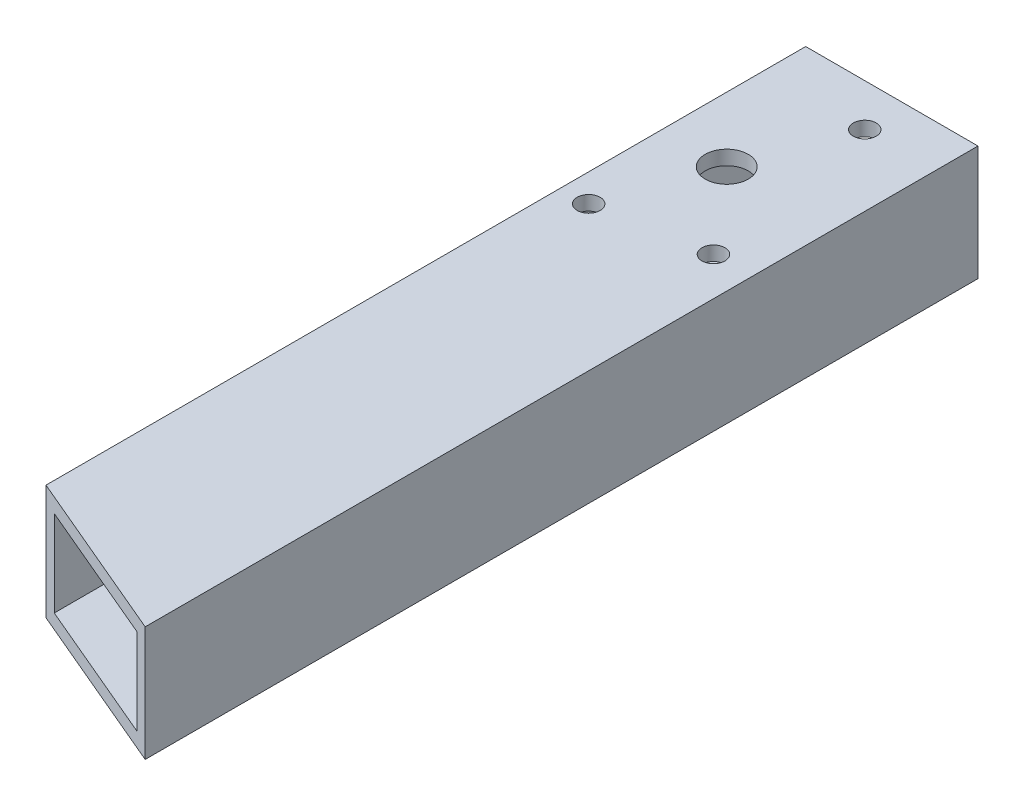
ISO-10303-21;
HEADER;
FILE_DESCRIPTION(('STEP AP214'),'2;1');
FILE_NAME('part.step','',(''),(''),'','','');
FILE_SCHEMA(('AUTOMOTIVE_DESIGN { 1 0 10303 214 1 1 1 1 }'));
ENDSEC;
DATA;
#1=APPLICATION_CONTEXT('core data for automotive mechanical design processes');
#2=APPLICATION_PROTOCOL_DEFINITION('international standard','automotive_design',2000,#1);
#3=PRODUCT_CONTEXT('',#1,'mechanical');
#4=PRODUCT('Part','Part','',(#3));
#5=PRODUCT_RELATED_PRODUCT_CATEGORY('part','',(#4));
#6=PRODUCT_DEFINITION_FORMATION('','',#4);
#7=PRODUCT_DEFINITION_CONTEXT('part definition',#1,'design');
#8=PRODUCT_DEFINITION('design','',#6,#7);
#9=PRODUCT_DEFINITION_SHAPE('','',#8);
#10=(LENGTH_UNIT() NAMED_UNIT(*) SI_UNIT(.MILLI.,.METRE.));
#11=(NAMED_UNIT(*) PLANE_ANGLE_UNIT() SI_UNIT($,.RADIAN.));
#12=(NAMED_UNIT(*) SI_UNIT($,.STERADIAN.) SOLID_ANGLE_UNIT());
#13=UNCERTAINTY_MEASURE_WITH_UNIT(LENGTH_MEASURE(1.E-05),#10,'distance_accuracy_value','');
#14=(GEOMETRIC_REPRESENTATION_CONTEXT(3) GLOBAL_UNCERTAINTY_ASSIGNED_CONTEXT((#13)) GLOBAL_UNIT_ASSIGNED_CONTEXT((#10,
#11,#12)) REPRESENTATION_CONTEXT('',''));
#15=CARTESIAN_POINT('',(0.,0.,0.));
#16=DIRECTION('',(0.,0.,1.));
#17=DIRECTION('',(1.,0.,0.));
#18=AXIS2_PLACEMENT_3D('',#15,#16,#17);
#19=CARTESIAN_POINT('',(0.,0.,0.));
#20=DIRECTION('',(0.,0.,1.));
#21=DIRECTION('',(1.,0.,0.));
#22=AXIS2_PLACEMENT_3D('',#19,#20,#21);
#23=PLANE('',#22);
#24=DIRECTION('',(0.,1.,0.));
#25=VECTOR('',#24,1.);
#26=CARTESIAN_POINT('',(19.05,12.7,0.));
#27=LINE('',#26,#25);
#28=CARTESIAN_POINT('',(19.05,-12.7,0.));
#29=VERTEX_POINT('',#28);
#30=CARTESIAN_POINT('',(19.05,12.7,0.));
#31=VERTEX_POINT('',#30);
#32=EDGE_CURVE('E118',#29,#31,#27,.T.);
#33=ORIENTED_EDGE('',*,*,#32,.F.);
#34=DIRECTION('',(1.,0.,0.));
#35=VECTOR('',#34,1.);
#36=CARTESIAN_POINT('',(-19.05,-12.7,0.));
#37=LINE('',#36,#35);
#38=CARTESIAN_POINT('',(-19.05,-12.7,0.));
#39=VERTEX_POINT('',#38);
#40=EDGE_CURVE('E106',#39,#29,#37,.T.);
#41=ORIENTED_EDGE('',*,*,#40,.F.);
#42=DIRECTION('',(0.,-1.,0.));
#43=VECTOR('',#42,1.);
#44=CARTESIAN_POINT('',(-19.05,12.7,0.));
#45=LINE('',#44,#43);
#46=CARTESIAN_POINT('',(-19.05,12.7,0.));
#47=VERTEX_POINT('',#46);
#48=EDGE_CURVE('E194',#47,#39,#45,.T.);
#49=ORIENTED_EDGE('',*,*,#48,.F.);
#50=DIRECTION('',(-1.,0.,0.));
#51=VECTOR('',#50,1.);
#52=CARTESIAN_POINT('',(-19.05,12.7,0.));
#53=LINE('',#52,#51);
#54=EDGE_CURVE('E192',#31,#47,#53,.T.);
#55=ORIENTED_EDGE('',*,*,#54,.F.);
#56=EDGE_LOOP('',(#33,#41,#49,#55));
#57=FACE_BOUND('',#56,.T.);
#58=DIRECTION('',(0.,1.,0.));
#59=VECTOR('',#58,1.);
#60=CARTESIAN_POINT('',(15.875,9.525,0.));
#61=LINE('',#60,#59);
#62=CARTESIAN_POINT('',(15.875,-9.525,0.));
#63=VERTEX_POINT('',#62);
#64=CARTESIAN_POINT('',(15.875,9.525,0.));
#65=VERTEX_POINT('',#64);
#66=EDGE_CURVE('E171',#63,#65,#61,.T.);
#67=ORIENTED_EDGE('',*,*,#66,.T.);
#68=DIRECTION('',(-1.,0.,0.));
#69=VECTOR('',#68,1.);
#70=CARTESIAN_POINT('',(-15.875,9.525,0.));
#71=LINE('',#70,#69);
#72=CARTESIAN_POINT('',(-15.875,9.525,0.));
#73=VERTEX_POINT('',#72);
#74=EDGE_CURVE('E174',#65,#73,#71,.T.);
#75=ORIENTED_EDGE('',*,*,#74,.T.);
#76=DIRECTION('',(0.,-1.,0.));
#77=VECTOR('',#76,1.);
#78=CARTESIAN_POINT('',(-15.875,9.525,0.));
#79=LINE('',#78,#77);
#80=CARTESIAN_POINT('',(-15.875,-9.525,0.));
#81=VERTEX_POINT('',#80);
#82=EDGE_CURVE('E177',#73,#81,#79,.T.);
#83=ORIENTED_EDGE('',*,*,#82,.T.);
#84=DIRECTION('',(1.,0.,0.));
#85=VECTOR('',#84,1.);
#86=CARTESIAN_POINT('',(-15.875,-9.525,0.));
#87=LINE('',#86,#85);
#88=EDGE_CURVE('E180',#81,#63,#87,.T.);
#89=ORIENTED_EDGE('',*,*,#88,.T.);
#90=EDGE_LOOP('',(#67,#75,#83,#89));
#91=FACE_BOUND('',#90,.T.);
#92=ADVANCED_FACE('F32',(#57,#91),#23,.F.);
#93=CARTESIAN_POINT('',(19.05,12.7,184.15));
#94=DIRECTION('',(-1.,0.,0.));
#95=DIRECTION('',(0.,-1.,0.));
#96=AXIS2_PLACEMENT_3D('',#93,#94,#95);
#97=PLANE('',#96);
#98=ORIENTED_EDGE('',*,*,#32,.T.);
#99=DIRECTION('',(0.,0.,-1.));
#100=VECTOR('',#99,1.);
#101=CARTESIAN_POINT('',(19.05,12.7,184.15));
#102=LINE('',#101,#100);
#103=CARTESIAN_POINT('',(19.05,12.7,184.15));
#104=VERTEX_POINT('',#103);
#105=EDGE_CURVE('E41',#104,#31,#102,.T.);
#106=ORIENTED_EDGE('',*,*,#105,.F.);
#107=DIRECTION('',(0.,1.,0.));
#108=VECTOR('',#107,1.);
#109=CARTESIAN_POINT('',(19.05,12.7,184.15));
#110=LINE('',#109,#108);
#111=CARTESIAN_POINT('',(19.05,-12.7,184.15));
#112=VERTEX_POINT('',#111);
#113=EDGE_CURVE('E96',#112,#104,#110,.T.);
#114=ORIENTED_EDGE('',*,*,#113,.F.);
#115=DIRECTION('',(0.,0.,-1.));
#116=VECTOR('',#115,1.);
#117=CARTESIAN_POINT('',(19.05,-12.7,184.15));
#118=LINE('',#117,#116);
#119=EDGE_CURVE('E105',#112,#29,#118,.T.);
#120=ORIENTED_EDGE('',*,*,#119,.T.);
#121=EDGE_LOOP('',(#98,#106,#114,#120));
#122=FACE_BOUND('',#121,.T.);
#123=ADVANCED_FACE('F34',(#122),#97,.F.);
#124=CARTESIAN_POINT('',(-19.05,12.7,184.15));
#125=DIRECTION('',(0.,-1.,0.));
#126=DIRECTION('',(0.,0.,-1.));
#127=AXIS2_PLACEMENT_3D('',#124,#125,#126);
#128=PLANE('',#127);
#129=CARTESIAN_POINT('',(10.5438799556607,12.7,49.9914333017707));
#130=DIRECTION('',(0.,1.,0.));
#131=DIRECTION('',(0.,0.,1.));
#132=AXIS2_PLACEMENT_3D('',#129,#130,#131);
#133=CIRCLE('',#132,2.54);
#134=CARTESIAN_POINT('',(10.5438799556607,12.7,52.5314333017707));
#135=VERTEX_POINT('',#134);
#136=EDGE_CURVE('E260',#135,#135,#133,.T.);
#137=ORIENTED_EDGE('',*,*,#136,.F.);
#138=EDGE_LOOP('',(#137));
#139=FACE_BOUND('',#138,.T.);
#140=CARTESIAN_POINT('',(3.3818546629425,12.7,9.37356946753555));
#141=DIRECTION('',(0.,1.,0.));
#142=DIRECTION('',(0.,0.,1.));
#143=AXIS2_PLACEMENT_3D('',#140,#141,#142);
#144=CIRCLE('',#143,2.54);
#145=CARTESIAN_POINT('',(3.3818546629425,12.7,11.9135694675356));
#146=VERTEX_POINT('',#145);
#147=EDGE_CURVE('E142',#146,#146,#144,.T.);
#148=ORIENTED_EDGE('',*,*,#147,.F.);
#149=EDGE_LOOP('',(#148));
#150=FACE_BOUND('',#149,.T.);
#151=CARTESIAN_POINT('',(-12.9068546629425,12.7,54.1264305324644));
#152=DIRECTION('',(0.,1.,0.));
#153=DIRECTION('',(0.,0.,1.));
#154=AXIS2_PLACEMENT_3D('',#151,#152,#153);
#155=CIRCLE('',#154,2.54);
#156=CARTESIAN_POINT('',(-12.9068546629425,12.7,56.6664305324644));
#157=VERTEX_POINT('',#156);
#158=EDGE_CURVE('E139',#157,#157,#155,.T.);
#159=ORIENTED_EDGE('',*,*,#158,.F.);
#160=EDGE_LOOP('',(#159));
#161=FACE_BOUND('',#160,.T.);
#162=CARTESIAN_POINT('',(-4.7625,12.7,31.75));
#163=DIRECTION('',(0.,1.,0.));
#164=DIRECTION('',(0.,0.,1.));
#165=AXIS2_PLACEMENT_3D('',#162,#163,#164);
#166=CIRCLE('',#165,4.7625);
#167=CARTESIAN_POINT('',(-4.7625,12.7,36.5125));
#168=VERTEX_POINT('',#167);
#169=EDGE_CURVE('E157',#168,#168,#166,.T.);
#170=ORIENTED_EDGE('',*,*,#169,.F.);
#171=EDGE_LOOP('',(#170));
#172=FACE_BOUND('',#171,.T.);
#173=DIRECTION('',(0.,0.,-1.));
#174=VECTOR('',#173,1.);
#175=CARTESIAN_POINT('',(-19.05,12.7,184.15));
#176=LINE('',#175,#174);
#177=CARTESIAN_POINT('',(-19.05,12.7,167.977509502414));
#178=VERTEX_POINT('',#177);
#179=EDGE_CURVE('E114',#178,#47,#176,.T.);
#180=ORIENTED_EDGE('',*,*,#179,.F.);
#181=DIRECTION('',(-0.920504853452443,0.,-0.390731128489268));
#182=VECTOR('',#181,1.);
#183=CARTESIAN_POINT('',(19.05,12.7,184.15));
#184=LINE('',#183,#182);
#185=EDGE_CURVE('E99',#104,#178,#184,.T.);
#186=ORIENTED_EDGE('',*,*,#185,.F.);
#187=ORIENTED_EDGE('',*,*,#105,.T.);
#188=ORIENTED_EDGE('',*,*,#54,.T.);
#189=EDGE_LOOP('',(#180,#186,#187,#188));
#190=FACE_BOUND('',#189,.T.);
#191=ADVANCED_FACE('F111',(#139,#150,#161,#172,#190),#128,.F.);
#192=CARTESIAN_POINT('',(-19.05,12.7,184.15));
#193=DIRECTION('',(1.,0.,0.));
#194=DIRECTION('',(0.,1.,0.));
#195=AXIS2_PLACEMENT_3D('',#192,#193,#194);
#196=PLANE('',#195);
#197=DIRECTION('',(0.,0.,-1.));
#198=VECTOR('',#197,1.);
#199=CARTESIAN_POINT('',(-19.05,-12.7,184.15));
#200=LINE('',#199,#198);
#201=CARTESIAN_POINT('',(-19.05,-12.7,167.977509502414));
#202=VERTEX_POINT('',#201);
#203=EDGE_CURVE('E120',#202,#39,#200,.T.);
#204=ORIENTED_EDGE('',*,*,#203,.F.);
#205=DIRECTION('',(0.,1.,0.));
#206=VECTOR('',#205,1.);
#207=CARTESIAN_POINT('',(-19.05,-54.0903303791417,167.977509502414));
#208=LINE('',#207,#206);
#209=EDGE_CURVE('E49',#202,#178,#208,.T.);
#210=ORIENTED_EDGE('',*,*,#209,.T.);
#211=ORIENTED_EDGE('',*,*,#179,.T.);
#212=ORIENTED_EDGE('',*,*,#48,.T.);
#213=EDGE_LOOP('',(#204,#210,#211,#212));
#214=FACE_BOUND('',#213,.T.);
#215=ADVANCED_FACE('F204',(#214),#196,.F.);
#216=CARTESIAN_POINT('',(-19.05,-12.7,184.15));
#217=DIRECTION('',(0.,1.,0.));
#218=DIRECTION('',(0.,0.,1.));
#219=AXIS2_PLACEMENT_3D('',#216,#217,#218);
#220=PLANE('',#219);
#221=CARTESIAN_POINT('',(10.5438799556607,-12.7,49.9914333017707));
#222=DIRECTION('',(0.,1.,0.));
#223=DIRECTION('',(0.,0.,1.));
#224=AXIS2_PLACEMENT_3D('',#221,#222,#223);
#225=CIRCLE('',#224,2.54);
#226=CARTESIAN_POINT('',(10.5438799556607,-12.7,52.5314333017707));
#227=VERTEX_POINT('',#226);
#228=EDGE_CURVE('E302',#227,#227,#225,.F.);
#229=ORIENTED_EDGE('',*,*,#228,.F.);
#230=EDGE_LOOP('',(#229));
#231=FACE_BOUND('',#230,.T.);
#232=CARTESIAN_POINT('',(3.3818546629425,-12.7,9.37356946753555));
#233=DIRECTION('',(0.,1.,0.));
#234=DIRECTION('',(0.,0.,1.));
#235=AXIS2_PLACEMENT_3D('',#232,#233,#234);
#236=CIRCLE('',#235,2.54);
#237=CARTESIAN_POINT('',(3.3818546629425,-12.7,11.9135694675356));
#238=VERTEX_POINT('',#237);
#239=EDGE_CURVE('E135',#238,#238,#236,.F.);
#240=ORIENTED_EDGE('',*,*,#239,.F.);
#241=EDGE_LOOP('',(#240));
#242=FACE_BOUND('',#241,.T.);
#243=CARTESIAN_POINT('',(-12.9068546629425,-12.7,54.1264305324644));
#244=DIRECTION('',(0.,1.,0.));
#245=DIRECTION('',(0.,0.,1.));
#246=AXIS2_PLACEMENT_3D('',#243,#244,#245);
#247=CIRCLE('',#246,2.54);
#248=CARTESIAN_POINT('',(-12.9068546629425,-12.7,56.6664305324644));
#249=VERTEX_POINT('',#248);
#250=EDGE_CURVE('E131',#249,#249,#247,.F.);
#251=ORIENTED_EDGE('',*,*,#250,.F.);
#252=EDGE_LOOP('',(#251));
#253=FACE_BOUND('',#252,.T.);
#254=CARTESIAN_POINT('',(-4.7625,-12.7,31.75));
#255=DIRECTION('',(0.,1.,0.));
#256=DIRECTION('',(0.,0.,1.));
#257=AXIS2_PLACEMENT_3D('',#254,#255,#256);
#258=CIRCLE('',#257,4.7625);
#259=CARTESIAN_POINT('',(-4.7625,-12.7,36.5125));
#260=VERTEX_POINT('',#259);
#261=EDGE_CURVE('E127',#260,#260,#258,.F.);
#262=ORIENTED_EDGE('',*,*,#261,.F.);
#263=EDGE_LOOP('',(#262));
#264=FACE_BOUND('',#263,.T.);
#265=ORIENTED_EDGE('',*,*,#119,.F.);
#266=DIRECTION('',(0.920504853452443,0.,0.390731128489268));
#267=VECTOR('',#266,1.);
#268=CARTESIAN_POINT('',(19.05,-12.7,184.15));
#269=LINE('',#268,#267);
#270=EDGE_CURVE('E100',#202,#112,#269,.T.);
#271=ORIENTED_EDGE('',*,*,#270,.F.);
#272=ORIENTED_EDGE('',*,*,#203,.T.);
#273=ORIENTED_EDGE('',*,*,#40,.T.);
#274=EDGE_LOOP('',(#265,#271,#272,#273));
#275=FACE_BOUND('',#274,.T.);
#276=ADVANCED_FACE('F200',(#231,#242,#253,#264,#275),#220,.F.);
#277=CARTESIAN_POINT('',(15.875,9.525,184.15));
#278=DIRECTION('',(-1.,0.,0.));
#279=DIRECTION('',(0.,-1.,0.));
#280=AXIS2_PLACEMENT_3D('',#277,#278,#279);
#281=PLANE('',#280);
#282=DIRECTION('',(0.,-1.,0.));
#283=VECTOR('',#282,1.);
#284=CARTESIAN_POINT('',(15.875,9.525,182.802292458535));
#285=LINE('',#284,#283);
#286=CARTESIAN_POINT('',(15.875,9.525,182.802292458535));
#287=VERTEX_POINT('',#286);
#288=CARTESIAN_POINT('',(15.875,-9.525,182.802292458535));
#289=VERTEX_POINT('',#288);
#290=EDGE_CURVE('E56',#287,#289,#285,.T.);
#291=ORIENTED_EDGE('',*,*,#290,.F.);
#292=DIRECTION('',(0.,0.,-1.));
#293=VECTOR('',#292,1.);
#294=CARTESIAN_POINT('',(15.875,9.525,184.15));
#295=LINE('',#294,#293);
#296=EDGE_CURVE('E189',#287,#65,#295,.T.);
#297=ORIENTED_EDGE('',*,*,#296,.T.);
#298=ORIENTED_EDGE('',*,*,#66,.F.);
#299=DIRECTION('',(0.,0.,-1.));
#300=VECTOR('',#299,1.);
#301=CARTESIAN_POINT('',(15.875,-9.525,184.15));
#302=LINE('',#301,#300);
#303=EDGE_CURVE('E183',#289,#63,#302,.T.);
#304=ORIENTED_EDGE('',*,*,#303,.F.);
#305=EDGE_LOOP('',(#291,#297,#298,#304));
#306=FACE_BOUND('',#305,.T.);
#307=ADVANCED_FACE('F214',(#306),#281,.T.);
#308=CARTESIAN_POINT('',(-15.875,9.525,184.15));
#309=DIRECTION('',(0.,-1.,0.));
#310=DIRECTION('',(0.,0.,-1.));
#311=AXIS2_PLACEMENT_3D('',#308,#309,#310);
#312=PLANE('',#311);
#313=CARTESIAN_POINT('',(10.5438799556607,9.52500000000001,49.9914333017707));
#314=DIRECTION('',(0.,-1.,0.));
#315=DIRECTION('',(0.,0.,-1.));
#316=AXIS2_PLACEMENT_3D('',#313,#314,#315);
#317=CIRCLE('',#316,2.54);
#318=CARTESIAN_POINT('',(10.5438799556607,9.52500000000001,47.4514333017707));
#319=VERTEX_POINT('',#318);
#320=EDGE_CURVE('E147',#319,#319,#317,.T.);
#321=ORIENTED_EDGE('',*,*,#320,.F.);
#322=EDGE_LOOP('',(#321));
#323=FACE_BOUND('',#322,.T.);
#324=CARTESIAN_POINT('',(3.3818546629425,9.52500000000001,9.37356946753555));
#325=DIRECTION('',(0.,-1.,0.));
#326=DIRECTION('',(0.,0.,-1.));
#327=AXIS2_PLACEMENT_3D('',#324,#325,#326);
#328=CIRCLE('',#327,2.54);
#329=CARTESIAN_POINT('',(3.3818546629425,9.52500000000001,6.83356946753555));
#330=VERTEX_POINT('',#329);
#331=EDGE_CURVE('E134',#330,#330,#328,.T.);
#332=ORIENTED_EDGE('',*,*,#331,.F.);
#333=EDGE_LOOP('',(#332));
#334=FACE_BOUND('',#333,.T.);
#335=CARTESIAN_POINT('',(-12.9068546629425,9.52500000000001,54.1264305324644));
#336=DIRECTION('',(0.,-1.,0.));
#337=DIRECTION('',(0.,0.,-1.));
#338=AXIS2_PLACEMENT_3D('',#335,#336,#337);
#339=CIRCLE('',#338,2.54);
#340=CARTESIAN_POINT('',(-12.9068546629425,9.52500000000001,51.5864305324644));
#341=VERTEX_POINT('',#340);
#342=EDGE_CURVE('E130',#341,#341,#339,.T.);
#343=ORIENTED_EDGE('',*,*,#342,.F.);
#344=EDGE_LOOP('',(#343));
#345=FACE_BOUND('',#344,.T.);
#346=CARTESIAN_POINT('',(-4.7625,9.52500000000001,31.75));
#347=DIRECTION('',(0.,-1.,0.));
#348=DIRECTION('',(0.,0.,-1.));
#349=AXIS2_PLACEMENT_3D('',#346,#347,#348);
#350=CIRCLE('',#349,4.7625);
#351=CARTESIAN_POINT('',(-4.7625,9.52500000000001,26.9875));
#352=VERTEX_POINT('',#351);
#353=EDGE_CURVE('E115',#352,#352,#350,.T.);
#354=ORIENTED_EDGE('',*,*,#353,.F.);
#355=EDGE_LOOP('',(#354));
#356=FACE_BOUND('',#355,.T.);
#357=DIRECTION('',(0.920504853452443,0.,0.390731128489268));
#358=VECTOR('',#357,1.);
#359=CARTESIAN_POINT('',(-10.5429717941404,9.525,171.588528736586));
#360=LINE('',#359,#358);
#361=CARTESIAN_POINT('',(-15.875,9.525,169.32521704388));
#362=VERTEX_POINT('',#361);
#363=EDGE_CURVE('E168',#362,#287,#360,.T.);
#364=ORIENTED_EDGE('',*,*,#363,.F.);
#365=DIRECTION('',(0.,0.,-1.));
#366=VECTOR('',#365,1.);
#367=CARTESIAN_POINT('',(-15.875,9.525,184.15));
#368=LINE('',#367,#366);
#369=EDGE_CURVE('E187',#362,#73,#368,.T.);
#370=ORIENTED_EDGE('',*,*,#369,.T.);
#371=ORIENTED_EDGE('',*,*,#74,.F.);
#372=ORIENTED_EDGE('',*,*,#296,.F.);
#373=EDGE_LOOP('',(#364,#370,#371,#372));
#374=FACE_BOUND('',#373,.T.);
#375=ADVANCED_FACE('F218',(#323,#334,#345,#356,#374),#312,.T.);
#376=CARTESIAN_POINT('',(-15.875,9.525,184.15));
#377=DIRECTION('',(1.,0.,0.));
#378=DIRECTION('',(0.,1.,0.));
#379=AXIS2_PLACEMENT_3D('',#376,#377,#378);
#380=PLANE('',#379);
#381=DIRECTION('',(0.,1.,0.));
#382=VECTOR('',#381,1.);
#383=CARTESIAN_POINT('',(-15.875,9.525,169.32521704388));
#384=LINE('',#383,#382);
#385=CARTESIAN_POINT('',(-15.875,-9.525,169.32521704388));
#386=VERTEX_POINT('',#385);
#387=EDGE_CURVE('E166',#386,#362,#384,.T.);
#388=ORIENTED_EDGE('',*,*,#387,.F.);
#389=DIRECTION('',(0.,0.,-1.));
#390=VECTOR('',#389,1.);
#391=CARTESIAN_POINT('',(-15.875,-9.525,184.15));
#392=LINE('',#391,#390);
#393=EDGE_CURVE('E185',#386,#81,#392,.T.);
#394=ORIENTED_EDGE('',*,*,#393,.T.);
#395=ORIENTED_EDGE('',*,*,#82,.F.);
#396=ORIENTED_EDGE('',*,*,#369,.F.);
#397=EDGE_LOOP('',(#388,#394,#395,#396));
#398=FACE_BOUND('',#397,.T.);
#399=ADVANCED_FACE('F223',(#398),#380,.T.);
#400=CARTESIAN_POINT('',(-15.875,-9.525,184.15));
#401=DIRECTION('',(0.,1.,0.));
#402=DIRECTION('',(0.,0.,1.));
#403=AXIS2_PLACEMENT_3D('',#400,#401,#402);
#404=PLANE('',#403);
#405=CARTESIAN_POINT('',(10.5438799556607,-9.525,49.9914333017707));
#406=DIRECTION('',(0.,1.,0.));
#407=DIRECTION('',(0.,0.,1.));
#408=AXIS2_PLACEMENT_3D('',#405,#406,#407);
#409=CIRCLE('',#408,2.54);
#410=CARTESIAN_POINT('',(10.5438799556607,-9.525,52.5314333017707));
#411=VERTEX_POINT('',#410);
#412=EDGE_CURVE('E36',#411,#411,#409,.T.);
#413=ORIENTED_EDGE('',*,*,#412,.F.);
#414=EDGE_LOOP('',(#413));
#415=FACE_BOUND('',#414,.T.);
#416=CARTESIAN_POINT('',(3.3818546629425,-9.525,9.37356946753555));
#417=DIRECTION('',(0.,1.,0.));
#418=DIRECTION('',(0.,0.,1.));
#419=AXIS2_PLACEMENT_3D('',#416,#417,#418);
#420=CIRCLE('',#419,2.54);
#421=CARTESIAN_POINT('',(3.3818546629425,-9.525,11.9135694675356));
#422=VERTEX_POINT('',#421);
#423=EDGE_CURVE('E132',#422,#422,#420,.T.);
#424=ORIENTED_EDGE('',*,*,#423,.F.);
#425=EDGE_LOOP('',(#424));
#426=FACE_BOUND('',#425,.T.);
#427=CARTESIAN_POINT('',(-12.9068546629425,-9.525,54.1264305324644));
#428=DIRECTION('',(0.,1.,0.));
#429=DIRECTION('',(0.,0.,1.));
#430=AXIS2_PLACEMENT_3D('',#427,#428,#429);
#431=CIRCLE('',#430,2.54);
#432=CARTESIAN_POINT('',(-12.9068546629425,-9.525,56.6664305324644));
#433=VERTEX_POINT('',#432);
#434=EDGE_CURVE('E128',#433,#433,#431,.T.);
#435=ORIENTED_EDGE('',*,*,#434,.F.);
#436=EDGE_LOOP('',(#435));
#437=FACE_BOUND('',#436,.T.);
#438=CARTESIAN_POINT('',(-4.7625,-9.525,31.75));
#439=DIRECTION('',(0.,1.,0.));
#440=DIRECTION('',(0.,0.,1.));
#441=AXIS2_PLACEMENT_3D('',#438,#439,#440);
#442=CIRCLE('',#441,4.7625);
#443=CARTESIAN_POINT('',(-4.7625,-9.525,36.5125));
#444=VERTEX_POINT('',#443);
#445=EDGE_CURVE('E124',#444,#444,#442,.T.);
#446=ORIENTED_EDGE('',*,*,#445,.F.);
#447=EDGE_LOOP('',(#446));
#448=FACE_BOUND('',#447,.T.);
#449=DIRECTION('',(-0.920504853452443,0.,-0.390731128489268));
#450=VECTOR('',#449,1.);
#451=CARTESIAN_POINT('',(-10.5429717941404,-9.525,171.588528736586));
#452=LINE('',#451,#450);
#453=EDGE_CURVE('E11',#289,#386,#452,.T.);
#454=ORIENTED_EDGE('',*,*,#453,.F.);
#455=ORIENTED_EDGE('',*,*,#303,.T.);
#456=ORIENTED_EDGE('',*,*,#88,.F.);
#457=ORIENTED_EDGE('',*,*,#393,.F.);
#458=EDGE_LOOP('',(#454,#455,#456,#457));
#459=FACE_BOUND('',#458,.T.);
#460=ADVANCED_FACE('F226',(#415,#426,#437,#448,#459),#404,.T.);
#461=CARTESIAN_POINT('',(19.05,-54.0903303791417,184.15));
#462=DIRECTION('',(0.390731128489268,0.,-0.920504853452443));
#463=DIRECTION('',(-0.920504853452443,0.,-0.390731128489268));
#464=AXIS2_PLACEMENT_3D('',#461,#462,#463);
#465=PLANE('',#464);
#466=ORIENTED_EDGE('',*,*,#290,.T.);
#467=ORIENTED_EDGE('',*,*,#453,.T.);
#468=ORIENTED_EDGE('',*,*,#387,.T.);
#469=ORIENTED_EDGE('',*,*,#363,.T.);
#470=EDGE_LOOP('',(#466,#467,#468,#469));
#471=FACE_BOUND('',#470,.T.);
#472=ORIENTED_EDGE('',*,*,#270,.T.);
#473=ORIENTED_EDGE('',*,*,#113,.T.);
#474=ORIENTED_EDGE('',*,*,#185,.T.);
#475=ORIENTED_EDGE('',*,*,#209,.F.);
#476=EDGE_LOOP('',(#472,#473,#474,#475));
#477=FACE_BOUND('',#476,.T.);
#478=ADVANCED_FACE('F98',(#471,#477),#465,.F.);
#479=CARTESIAN_POINT('',(-4.7625,-26.1703841816037,31.75));
#480=DIRECTION('',(0.,1.,0.));
#481=DIRECTION('',(0.,0.,1.));
#482=AXIS2_PLACEMENT_3D('',#479,#480,#481);
#483=CYLINDRICAL_SURFACE('',#482,4.7625);
#484=ORIENTED_EDGE('',*,*,#445,.T.);
#485=EDGE_LOOP('',(#484));
#486=FACE_BOUND('',#485,.T.);
#487=ORIENTED_EDGE('',*,*,#261,.T.);
#488=EDGE_LOOP('',(#487));
#489=FACE_BOUND('',#488,.T.);
#490=ADVANCED_FACE('F228',(#486,#489),#483,.F.);
#491=ORIENTED_EDGE('',*,*,#353,.T.);
#492=EDGE_LOOP('',(#491));
#493=FACE_BOUND('',#492,.T.);
#494=ORIENTED_EDGE('',*,*,#169,.T.);
#495=EDGE_LOOP('',(#494));
#496=FACE_BOUND('',#495,.T.);
#497=ADVANCED_FACE('F234',(#493,#496),#483,.F.);
#498=CARTESIAN_POINT('',(-12.9068546629425,-26.1703841816037,54.1264305324644));
#499=DIRECTION('',(0.,1.,0.));
#500=DIRECTION('',(0.,0.,1.));
#501=AXIS2_PLACEMENT_3D('',#498,#499,#500);
#502=CYLINDRICAL_SURFACE('',#501,2.54);
#503=ORIENTED_EDGE('',*,*,#434,.T.);
#504=EDGE_LOOP('',(#503));
#505=FACE_BOUND('',#504,.T.);
#506=ORIENTED_EDGE('',*,*,#250,.T.);
#507=EDGE_LOOP('',(#506));
#508=FACE_BOUND('',#507,.T.);
#509=ADVANCED_FACE('F268',(#505,#508),#502,.F.);
#510=ORIENTED_EDGE('',*,*,#342,.T.);
#511=EDGE_LOOP('',(#510));
#512=FACE_BOUND('',#511,.T.);
#513=ORIENTED_EDGE('',*,*,#158,.T.);
#514=EDGE_LOOP('',(#513));
#515=FACE_BOUND('',#514,.T.);
#516=ADVANCED_FACE('F273',(#512,#515),#502,.F.);
#517=CARTESIAN_POINT('',(3.3818546629425,-26.1703841816037,9.37356946753555));
#518=DIRECTION('',(0.,1.,0.));
#519=DIRECTION('',(0.,0.,1.));
#520=AXIS2_PLACEMENT_3D('',#517,#518,#519);
#521=CYLINDRICAL_SURFACE('',#520,2.54);
#522=ORIENTED_EDGE('',*,*,#423,.T.);
#523=EDGE_LOOP('',(#522));
#524=FACE_BOUND('',#523,.T.);
#525=ORIENTED_EDGE('',*,*,#239,.T.);
#526=EDGE_LOOP('',(#525));
#527=FACE_BOUND('',#526,.T.);
#528=ADVANCED_FACE('F280',(#524,#527),#521,.F.);
#529=ORIENTED_EDGE('',*,*,#331,.T.);
#530=EDGE_LOOP('',(#529));
#531=FACE_BOUND('',#530,.T.);
#532=ORIENTED_EDGE('',*,*,#147,.T.);
#533=EDGE_LOOP('',(#532));
#534=FACE_BOUND('',#533,.T.);
#535=ADVANCED_FACE('F286',(#531,#534),#521,.F.);
#536=CARTESIAN_POINT('',(10.5438799556607,-26.1703841816037,49.9914333017707));
#537=DIRECTION('',(0.,1.,0.));
#538=DIRECTION('',(0.,0.,1.));
#539=AXIS2_PLACEMENT_3D('',#536,#537,#538);
#540=CYLINDRICAL_SURFACE('',#539,2.54);
#541=ORIENTED_EDGE('',*,*,#412,.T.);
#542=EDGE_LOOP('',(#541));
#543=FACE_BOUND('',#542,.T.);
#544=ORIENTED_EDGE('',*,*,#228,.T.);
#545=EDGE_LOOP('',(#544));
#546=FACE_BOUND('',#545,.T.);
#547=ADVANCED_FACE('F287',(#543,#546),#540,.F.);
#548=ORIENTED_EDGE('',*,*,#320,.T.);
#549=EDGE_LOOP('',(#548));
#550=FACE_BOUND('',#549,.T.);
#551=ORIENTED_EDGE('',*,*,#136,.T.);
#552=EDGE_LOOP('',(#551));
#553=FACE_BOUND('',#552,.T.);
#554=ADVANCED_FACE('F289',(#550,#553),#540,.F.);
#555=CLOSED_SHELL('',(#92,#123,#191,#215,#276,#307,#375,#399,#460,#478,#490,#497,#509,#516,#528,
#535,#547,#554));
#556=MANIFOLD_SOLID_BREP('B2',#555);
#557=ADVANCED_BREP_SHAPE_REPRESENTATION('',(#18,#556),#14);
#558=SHAPE_DEFINITION_REPRESENTATION(#9,#557);
ENDSEC;
END-ISO-10303-21;
